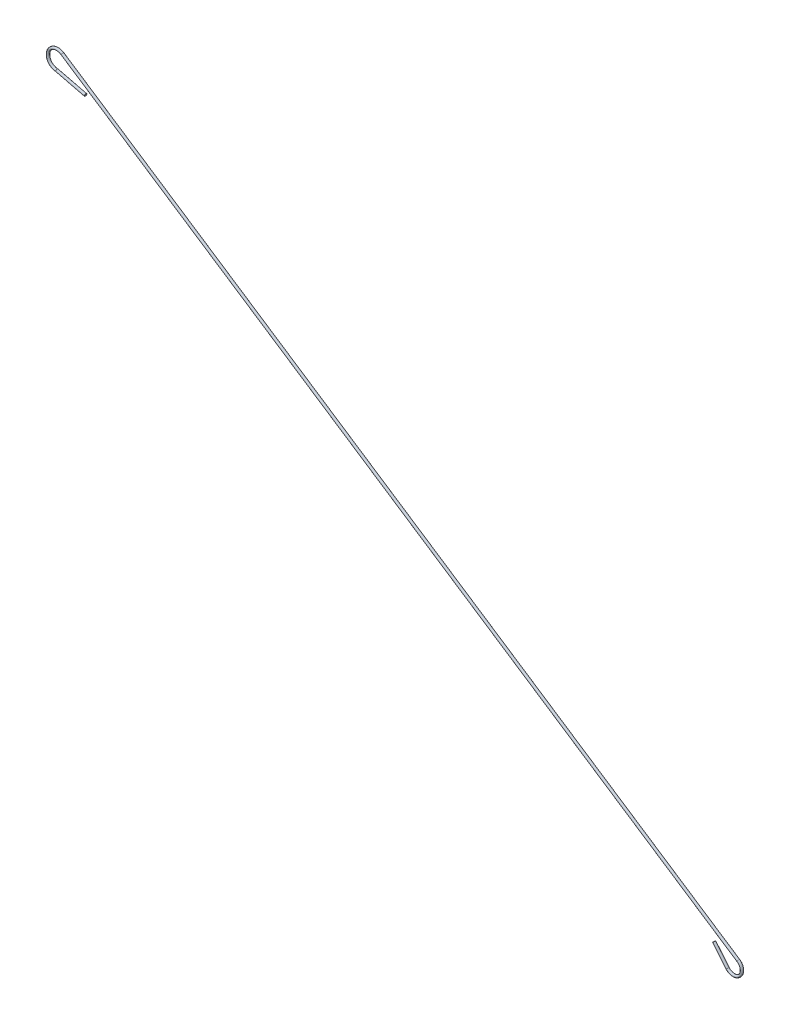
ISO-10303-21;
HEADER;
FILE_DESCRIPTION(('STEP AP214'),'2;1');
FILE_NAME('part.step','',(''),(''),'','','');
FILE_SCHEMA(('AUTOMOTIVE_DESIGN { 1 0 10303 214 1 1 1 1 }'));
ENDSEC;
DATA;
#1=APPLICATION_CONTEXT('core data for automotive mechanical design processes');
#2=APPLICATION_PROTOCOL_DEFINITION('international standard','automotive_design',2000,#1);
#3=PRODUCT_CONTEXT('',#1,'mechanical');
#4=PRODUCT('Part','Part','',(#3));
#5=PRODUCT_RELATED_PRODUCT_CATEGORY('part','',(#4));
#6=PRODUCT_DEFINITION_FORMATION('','',#4);
#7=PRODUCT_DEFINITION_CONTEXT('part definition',#1,'design');
#8=PRODUCT_DEFINITION('design','',#6,#7);
#9=PRODUCT_DEFINITION_SHAPE('','',#8);
#10=(LENGTH_UNIT() NAMED_UNIT(*) SI_UNIT(.MILLI.,.METRE.));
#11=(NAMED_UNIT(*) PLANE_ANGLE_UNIT() SI_UNIT($,.RADIAN.));
#12=(NAMED_UNIT(*) SI_UNIT($,.STERADIAN.) SOLID_ANGLE_UNIT());
#13=UNCERTAINTY_MEASURE_WITH_UNIT(LENGTH_MEASURE(1.E-05),#10,'distance_accuracy_value','');
#14=(GEOMETRIC_REPRESENTATION_CONTEXT(3) GLOBAL_UNCERTAINTY_ASSIGNED_CONTEXT((#13)) GLOBAL_UNIT_ASSIGNED_CONTEXT((#10,
#11,#12)) REPRESENTATION_CONTEXT('',''));
#15=CARTESIAN_POINT('',(0.,0.,0.));
#16=DIRECTION('',(0.,0.,1.));
#17=DIRECTION('',(1.,0.,0.));
#18=AXIS2_PLACEMENT_3D('',#15,#16,#17);
#19=CARTESIAN_POINT('',(-427.811917317596,812.633257480456,-763.238321143035));
#20=DIRECTION('',(-0.97147118341322,0.237157626480192,2.80395346130499E-13));
#21=DIRECTION('',(-0.237157626480192,-0.97147118341322,0.));
#22=AXIS2_PLACEMENT_3D('',#19,#20,#21);
#23=PLANE('',#22);
#24=CARTESIAN_POINT('',(-427.811917317596,812.633257480456,-763.238321143035));
#25=DIRECTION('',(-0.97147118341322,0.237157626480192,2.80395346130499E-13));
#26=DIRECTION('',(-0.237157626480192,-0.97147118341322,0.));
#27=AXIS2_PLACEMENT_3D('',#24,#25,#26);
#28=CIRCLE('',#27,1.190625);
#29=CARTESIAN_POINT('',(-428.094283116624,811.476599602705,-763.238321143035));
#30=VERTEX_POINT('',#29);
#31=EDGE_CURVE('E54',#30,#30,#28,.T.);
#32=ORIENTED_EDGE('',*,*,#31,.F.);
#33=EDGE_LOOP('',(#32));
#34=FACE_BOUND('',#33,.T.);
#35=ADVANCED_FACE('F51',(#34),#23,.F.);
#36=CARTESIAN_POINT('',(179.33350659523,408.024809585461,-763.238321143484));
#37=DIRECTION('',(-0.633306831925421,0.773900805424434,3.07352405207051E-13));
#38=DIRECTION('',(-0.773900805424434,-0.633306831925421,6.42431297641695E-12));
#39=AXIS2_PLACEMENT_3D('',#36,#37,#38);
#40=PLANE('',#39);
#41=CARTESIAN_POINT('',(179.33350659523,408.024809585461,-763.238321143484));
#42=DIRECTION('',(-0.633306831925421,0.773900805424434,3.07352405207051E-13));
#43=DIRECTION('',(-0.773900805424434,-0.633306831925421,6.42431297641695E-12));
#44=AXIS2_PLACEMENT_3D('',#41,#42,#43);
#45=CIRCLE('',#44,1.190625);
#46=CARTESIAN_POINT('',(178.412080948772,407.270778638699,-763.238321143476));
#47=VERTEX_POINT('',#46);
#48=EDGE_CURVE('E79',#47,#47,#45,.T.);
#49=ORIENTED_EDGE('',*,*,#48,.T.);
#50=EDGE_LOOP('',(#49));
#51=FACE_BOUND('',#50,.T.);
#52=ADVANCED_FACE('F74',(#51),#40,.T.);
#53=CARTESIAN_POINT('',(-455.729617251785,819.448586196555,-763.238321143027));
#54=DIRECTION('',(0.971471183413222,-0.237157626480181,-2.84289725937867E-13));
#55=DIRECTION('',(0.237157626480181,0.971471183413223,0.));
#56=AXIS2_PLACEMENT_3D('',#53,#54,#55);
#57=CYLINDRICAL_SURFACE('',#56,1.190625);
#58=CARTESIAN_POINT('',(-455.506947821375,819.394227658349,-762.047696143027));
#59=CARTESIAN_POINT('',(-455.506215987604,819.399379265152,-762.047695914951));
#60=CARTESIAN_POINT('',(-455.505484007496,819.404531909561,-762.047729726224));
#61=CARTESIAN_POINT('',(-455.495280057859,819.476360910007,-762.048674755256));
#62=CARTESIAN_POINT('',(-455.48579689012,819.543117323886,-762.055241874011));
#63=CARTESIAN_POINT('',(-455.471797114903,819.641669784175,-762.073475469619));
#64=CARTESIAN_POINT('',(-455.467160792931,819.674307782612,-762.080969199596));
#65=CARTESIAN_POINT('',(-455.457988837744,819.738875425088,-762.098712502301));
#66=CARTESIAN_POINT('',(-455.453453285487,819.770804499573,-762.108964209834));
#67=CARTESIAN_POINT('',(-455.440070956556,819.865013105617,-762.143713796841));
#68=CARTESIAN_POINT('',(-455.431424486765,819.925883117883,-762.172237607888));
#69=CARTESIAN_POINT('',(-455.414930616801,820.041998825476,-762.239238418446));
#70=CARTESIAN_POINT('',(-455.407083234408,820.09724439565,-762.277715639366));
#71=CARTESIAN_POINT('',(-455.396092977923,820.174616252885,-762.341987826876));
#72=CARTESIAN_POINT('',(-455.392561197763,820.19948021125,-762.364492289753));
#73=CARTESIAN_POINT('',(-455.385780905778,820.247214017897,-762.411518584101));
#74=CARTESIAN_POINT('',(-455.382532124255,820.270085764745,-762.436038450604));
#75=CARTESIAN_POINT('',(-455.373239438633,820.33550732404,-762.512428009248));
#76=CARTESIAN_POINT('',(-455.367646907311,820.374879550011,-762.567141051422));
#77=CARTESIAN_POINT('',(-455.357869488075,820.443714125231,-762.682206143659));
#78=CARTESIAN_POINT('',(-455.353678142155,820.473221939144,-762.742530637829));
#79=CARTESIAN_POINT('',(-455.346785412331,820.521748018074,-762.867348047546));
#80=CARTESIAN_POINT('',(-455.344083960496,820.540766761343,-762.93184077289));
#81=CARTESIAN_POINT('',(-455.340259679259,820.567690449273,-763.062863732348));
#82=CARTESIAN_POINT('',(-455.339130223435,820.575642045191,-763.129384198509));
#83=CARTESIAN_POINT('',(-455.338461217713,820.580351979332,-763.262827796362));
#84=CARTESIAN_POINT('',(-455.338921645285,820.577110476173,-763.329750922335));
#85=CARTESIAN_POINT('',(-455.341416733697,820.559544558942,-763.461961774375));
#86=CARTESIAN_POINT('',(-455.343448256772,820.545242235345,-763.527252492661));
#87=CARTESIAN_POINT('',(-455.349021425584,820.506006070578,-763.654480094402));
#88=CARTESIAN_POINT('',(-455.352563090555,820.481072093993,-763.716416935129));
#89=CARTESIAN_POINT('',(-455.361062924391,820.421231813305,-763.835293274604));
#90=CARTESIAN_POINT('',(-455.366022734106,820.386313957461,-763.892226884076));
#91=CARTESIAN_POINT('',(-455.374405842347,820.327295737599,-763.972539883299));
#92=CARTESIAN_POINT('',(-455.377358022983,820.306512015804,-763.998466933777));
#93=CARTESIAN_POINT('',(-455.383560070111,820.262848920525,-764.048498526526));
#94=CARTESIAN_POINT('',(-455.386810218447,820.239967562916,-764.072601303076));
#95=CARTESIAN_POINT('',(-455.397024400982,820.168058924099,-764.142240904372));
#96=CARTESIAN_POINT('',(-455.404410711185,820.116058972842,-764.18471216823));
#97=CARTESIAN_POINT('',(-455.420082046356,820.005732993514,-764.260221603041));
#98=CARTESIAN_POINT('',(-455.428367083088,819.947406882644,-764.293259650507));
#99=CARTESIAN_POINT('',(-455.441288493394,819.856442055213,-764.335072813824));
#100=CARTESIAN_POINT('',(-455.445683169117,819.825504353283,-764.347729759628));
#101=CARTESIAN_POINT('',(-455.454602117069,819.762717020815,-764.37036455994));
#102=CARTESIAN_POINT('',(-455.459126274343,819.730868199189,-764.380344713985));
#103=CARTESIAN_POINT('',(-455.472837531514,819.634345435138,-764.406137302704));
#104=CARTESIAN_POINT('',(-455.482186211842,819.56853471872,-764.417875426687));
#105=CARTESIAN_POINT('',(-455.495970900789,819.471498098878,-764.426819165083));
#106=CARTESIAN_POINT('',(-455.500360413148,819.440598598772,-764.428439519857));
#107=CARTESIAN_POINT('',(-455.50548387418,819.404532849087,-764.428912301333));
#108=CARTESIAN_POINT('',(-455.506215844573,819.399380272763,-764.428946088555));
#109=CARTESIAN_POINT('',(-455.506947821457,819.394227658017,-764.428946143027));
#110=B_SPLINE_CURVE_WITH_KNOTS('',3,(#58,#59,#60,#61,#62,#63,#64,#65,#66,#67,#68,#69,#70,#71,
#72,#73,#74,#75,#76,#77,#78,#79,#80,#81,#82,#83,#84,#85,#86,#87,#88,#89,#90,#91,#92,#93,#94,#95,
#96,#97,#98,#99,#100,#101,#102,#103,#104,#105,#106,#107,#108,#109),.UNSPECIFIED.,.F.,.F.,(4,2,2,
2,2,2,2,2,2,2,2,2,2,2,2,2,2,2,2,2,2,2,2,2,2,4),(0.,0.0156128978433105,0.217626923769604,
0.318958240078146,0.420368218419293,0.622673919988737,0.824984122134778,0.926042621814403,
1.02700373483835,1.22886358601933,1.42977981651817,1.63068688540176,1.83074448072526,
2.03079924101315,2.23045548402431,2.43011427011465,2.63000501063117,2.72998419446327,
2.83005894271063,3.03167255656076,3.23328880954208,3.33432481610452,3.43527374615147,
3.63664403113962,3.73032278199967,3.74593567987358),.UNSPECIFIED.);
#111=CARTESIAN_POINT('',(-455.506947821375,819.394227658349,-762.047696143027));
#112=VERTEX_POINT('',#111);
#113=CARTESIAN_POINT('',(-455.506947821457,819.394227658017,-764.428946143027));
#114=VERTEX_POINT('',#113);
#115=EDGE_CURVE('E12',#112,#114,#110,.T.);
#116=ORIENTED_EDGE('',*,*,#115,.F.);
#117=CARTESIAN_POINT('',(-455.506947821375,819.394227658349,-762.047696143027));
#118=CARTESIAN_POINT('',(-455.507679651034,819.389076051459,-762.047695914888));
#119=CARTESIAN_POINT('',(-455.508411851647,819.383923438271,-762.047729726174));
#120=CARTESIAN_POINT('',(-455.518617781846,819.312124939185,-762.048674377956));
#121=CARTESIAN_POINT('',(-455.528139896207,819.245404302967,-762.055236211645));
#122=CARTESIAN_POINT('',(-455.542251726922,819.146911880592,-762.073457351917));
#123=CARTESIAN_POINT('',(-455.546934448893,819.114295053425,-762.080946142652));
#124=CARTESIAN_POINT('',(-455.556215723445,819.049771690596,-762.09867842135));
#125=CARTESIAN_POINT('',(-455.560814207841,819.017865726181,-762.108924043962));
#126=CARTESIAN_POINT('',(-455.574407395764,818.923727935185,-762.143654534116));
#127=CARTESIAN_POINT('',(-455.583223917142,818.862908222617,-762.172164279168));
#128=CARTESIAN_POINT('',(-455.60009670213,818.746897534152,-762.239134975519));
#129=CARTESIAN_POINT('',(-455.608152948966,818.691706682433,-762.277596146288));
#130=CARTESIAN_POINT('',(-455.619465809826,818.614422217088,-762.341837742253));
#131=CARTESIAN_POINT('',(-455.623106288238,818.589590521813,-762.364328291743));
#132=CARTESIAN_POINT('',(-455.630104273477,818.54191966187,-762.411325087488));
#133=CARTESIAN_POINT('',(-455.633462049657,818.519078599817,-762.435829370069));
#134=CARTESIAN_POINT('',(-455.643077676558,818.453745405097,-762.512169557639));
#135=CARTESIAN_POINT('',(-455.648880167812,818.414427284398,-762.566846107033));
#136=CARTESIAN_POINT('',(-455.659043514369,818.345672757979,-762.681848619325));
#137=CARTESIAN_POINT('',(-455.663410575927,818.316193802646,-762.742148774722));
#138=CARTESIAN_POINT('',(-455.67060099163,818.267706462117,-762.866915207789));
#139=CARTESIAN_POINT('',(-455.673424410663,818.248697636797,-762.931381310212));
#140=CARTESIAN_POINT('',(-455.677426956591,818.22176181659,-763.062390509499));
#141=CARTESIAN_POINT('',(-455.678612026129,818.213794770555,-763.128925200062));
#142=CARTESIAN_POINT('',(-455.679318909851,818.209041679464,-763.262401227338));
#143=CARTESIAN_POINT('',(-455.678840744028,818.212255500012,-763.329342559154));
#144=CARTESIAN_POINT('',(-455.676238558345,818.229758556292,-763.46161733251));
#145=CARTESIAN_POINT('',(-455.674117255339,818.244029509554,-763.526953244732));
#146=CARTESIAN_POINT('',(-455.668301978558,818.283204011499,-763.654273059037));
#147=CARTESIAN_POINT('',(-455.664607980623,818.308107723519,-763.716256909611));
#148=CARTESIAN_POINT('',(-455.655757670498,818.36788782864,-763.835213604914));
#149=CARTESIAN_POINT('',(-455.650599950513,818.40277382288,-763.892181555943));
#150=CARTESIAN_POINT('',(-455.641902066748,818.461749640698,-763.972542217068));
#151=CARTESIAN_POINT('',(-455.638841983763,818.482519937224,-763.998484332991));
#152=CARTESIAN_POINT('',(-455.63242103764,818.526158387955,-764.048544220208));
#153=CARTESIAN_POINT('',(-455.629059892569,818.54902850908,-764.072660241606));
#154=CARTESIAN_POINT('',(-455.618549357286,818.620646787442,-764.142083903105));
#155=CARTESIAN_POINT('',(-455.610983810013,818.672328778637,-764.184366383355));
#156=CARTESIAN_POINT('',(-455.594988492246,818.781971311061,-764.259593392493));
#157=CARTESIAN_POINT('',(-455.586558708039,818.839931951908,-764.292537773191));
#158=CARTESIAN_POINT('',(-455.573423418448,818.930585905223,-764.334405619344));
#159=CARTESIAN_POINT('',(-455.568938533018,818.961594259012,-764.347149787044));
#160=CARTESIAN_POINT('',(-455.559852502883,819.024535249325,-764.369941409951));
#161=CARTESIAN_POINT('',(-455.55525146054,819.056467075433,-764.379991154653));
#162=CARTESIAN_POINT('',(-455.541333151372,819.15325428721,-764.405964676948));
#163=CARTESIAN_POINT('',(-455.531877389456,819.219262196186,-764.417786796208));
#164=CARTESIAN_POINT('',(-455.517982012339,819.316654402481,-764.426803127542));
#165=CARTESIAN_POINT('',(-455.513560202012,819.347704733832,-764.428437517434));
#166=CARTESIAN_POINT('',(-455.508411989057,819.383922499231,-764.428912300994));
#167=CARTESIAN_POINT('',(-455.50767979857,819.389075044435,-764.428946088199));
#168=CARTESIAN_POINT('',(-455.506947821457,819.394227658017,-764.428946143027));
#169=B_SPLINE_CURVE_WITH_KNOTS('',3,(#117,#118,#119,#120,#121,#122,#123,#124,#125,#126,#127,
#128,#129,#130,#131,#132,#133,#134,#135,#136,#137,#138,#139,#140,#141,#142,#143,#144,#145,#146,
#147,#148,#149,#150,#151,#152,#153,#154,#155,#156,#157,#158,#159,#160,#161,#162,#163,#164,#165,
#166,#167,#168),.UNSPECIFIED.,.F.,.F.,(4,2,2,2,2,2,2,2,2,2,2,2,2,2,2,2,2,2,2,2,2,2,2,2,2,4),(0.,
0.0156128978628568,0.217537158681582,0.31882307801608,0.420187651028619,0.622405831190798,
0.824628471476367,0.925622579108062,1.02651934599287,1.22825090969588,1.42909842391222,
1.62993749463465,1.83004615083755,2.03015240171508,2.22992849019712,2.42970764769069,
2.62967960601839,2.72969785225555,2.82981076114542,3.0304083849154,3.23100919189691,
3.33237209743685,3.43364859834372,3.63567243167567,3.72981315416662,3.74542605205941),.UNSPECIFIED.);
#170=EDGE_CURVE('E59',#112,#114,#169,.T.);
#171=ORIENTED_EDGE('',*,*,#170,.T.);
#172=EDGE_LOOP('',(#116,#171));
#173=FACE_BOUND('',#172,.T.);
#174=ORIENTED_EDGE('',*,*,#31,.T.);
#175=EDGE_LOOP('',(#174));
#176=FACE_BOUND('',#175,.T.);
#177=ADVANCED_FACE('F70',(#173,#176),#57,.T.);
#178=CARTESIAN_POINT('',(179.33350659523,408.024809585461,-763.238321143484));
#179=DIRECTION('',(0.63330683192543,-0.773900805424426,-3.11246785014493E-13));
#180=DIRECTION('',(0.773900805424426,0.63330683192543,0.));
#181=AXIS2_PLACEMENT_3D('',#178,#179,#180);
#182=CYLINDRICAL_SURFACE('',#181,1.190625);
#183=CARTESIAN_POINT('',(192.209904372681,392.289854412724,-763.23832114349));
#184=DIRECTION('',(-0.633306831925421,0.773900805424434,3.07352405207051E-13));
#185=DIRECTION('',(-0.773900805424434,-0.633306831925421,6.42431297641695E-12));
#186=AXIS2_PLACEMENT_3D('',#183,#184,#185);
#187=CIRCLE('',#186,1.190625);
#188=CARTESIAN_POINT('',(191.288478726222,391.535823465963,-763.238321143488));
#189=VERTEX_POINT('',#188);
#190=EDGE_CURVE('E81',#189,#189,#187,.T.);
#191=ORIENTED_EDGE('',*,*,#190,.T.);
#192=EDGE_LOOP('',(#191));
#193=FACE_BOUND('',#192,.T.);
#194=ORIENTED_EDGE('',*,*,#48,.F.);
#195=EDGE_LOOP('',(#194));
#196=FACE_BOUND('',#195,.T.);
#197=ADVANCED_FACE('F73',(#193,#196),#182,.T.);
#198=CARTESIAN_POINT('',(198.312321245531,397.283649831651,-763.2383211435));
#199=DIRECTION('',(1.15101615086029E-12,5.42068768295062E-13,1.));
#200=DIRECTION('',(1.,0.,-1.15101615086029E-12));
#201=AXIS2_PLACEMENT_3D('',#198,#199,#200);
#202=TOROIDAL_SURFACE('',#201,7.88527008897896,1.190625);
#203=CARTESIAN_POINT('',(202.664175314005,403.859275318466,-763.238321143508));
#204=DIRECTION('',(0.83391252456977,-0.551896640110875,-6.6457523206083E-13));
#205=DIRECTION('',(0.551896640110875,0.83391252456977,4.10296491444247E-12));
#206=AXIS2_PLACEMENT_3D('',#203,#204,#205);
#207=CIRCLE('',#206,1.190625);
#208=CARTESIAN_POINT('',(203.321277251137,404.852152418032,-763.23832114351));
#209=VERTEX_POINT('',#208);
#210=EDGE_CURVE('E86',#209,#209,#207,.T.);
#211=CARTESIAN_POINT('',(198.312321245531,397.283649831651,-763.2383211435));
#212=DIRECTION('',(1.15101615086029E-12,5.42068768295062E-13,1.));
#213=DIRECTION('',(1.,0.,-1.15101615086029E-12));
#214=AXIS2_PLACEMENT_3D('',#211,#212,#213);
#215=CIRCLE('',#214,9.07589508897896);
#216=EDGE_CURVE('',#189,#209,#215,.T.);
#217=ORIENTED_EDGE('',*,*,#190,.F.);
#218=ORIENTED_EDGE('',*,*,#210,.T.);
#219=ORIENTED_EDGE('',*,*,#216,.T.);
#220=ORIENTED_EDGE('',*,*,#216,.F.);
#221=EDGE_LOOP('',(#217,#219,#218,#220));
#222=FACE_BOUND('',#221,.T.);
#223=ADVANCED_FACE('F117',(#222),#202,.T.);
#224=CARTESIAN_POINT('',(202.664175314005,403.859275318466,-763.238321143508));
#225=DIRECTION('',(-0.83391252456978,0.551896640110861,6.61594570082882E-13));
#226=DIRECTION('',(-0.551896640110861,-0.83391252456978,0.));
#227=AXIS2_PLACEMENT_3D('',#224,#225,#226);
#228=CYLINDRICAL_SURFACE('',#227,1.190625);
#229=CARTESIAN_POINT('',(-450.151301902883,835.902994381497,-763.23832114299));
#230=DIRECTION('',(0.833912524569774,-0.55189664011087,-6.65488949890298E-13));
#231=DIRECTION('',(0.55189664011087,0.833912524569774,4.10296491444248E-12));
#232=AXIS2_PLACEMENT_3D('',#229,#230,#231);
#233=CIRCLE('',#232,1.190625);
#234=CARTESIAN_POINT('',(-449.494199965751,836.895871481063,-763.238321142985));
#235=VERTEX_POINT('',#234);
#236=EDGE_CURVE('E69',#235,#235,#233,.T.);
#237=ORIENTED_EDGE('',*,*,#236,.T.);
#238=EDGE_LOOP('',(#237));
#239=FACE_BOUND('',#238,.T.);
#240=ORIENTED_EDGE('',*,*,#210,.F.);
#241=EDGE_LOOP('',(#240));
#242=FACE_BOUND('',#241,.T.);
#243=ADVANCED_FACE('F113',(#239,#242),#228,.T.);
#244=CARTESIAN_POINT('',(-449.494199965751,836.895871481063,-763.238321142985));
#245=CARTESIAN_POINT('',(-450.799290368604,837.759601173511,-763.238321142984));
#246=CARTESIAN_POINT('',(-452.305697131396,838.317040742987,-763.238321142985));
#247=CARTESIAN_POINT('',(-455.411626219133,838.70480449474,-763.238321142985));
#248=CARTESIAN_POINT('',(-457.008846794635,838.534841185737,-763.238321142988));
#249=CARTESIAN_POINT('',(-459.963622143405,837.502146234793,-763.238321142988));
#250=CARTESIAN_POINT('',(-461.318987409402,836.640179826368,-763.238321142919));
#251=CARTESIAN_POINT('',(-463.507188807719,834.402115737737,-763.238321143072));
#252=CARTESIAN_POINT('',(-464.338403468991,833.027676477408,-763.238321142928));
#253=CARTESIAN_POINT('',(-465.304272624066,830.050386938444,-763.238321143082));
#254=CARTESIAN_POINT('',(-465.438211402914,828.449742850299,-763.238321142938));
#255=CARTESIAN_POINT('',(-464.980577217235,825.353337325061,-763.238321143091));
#256=CARTESIAN_POINT('',(-464.389343362918,823.859870344366,-763.238321142946));
#257=CARTESIAN_POINT('',(-462.60352182283,821.289267758867,-763.238321143099));
#258=CARTESIAN_POINT('',(-461.410257392489,820.214036959606,-763.238321143027));
#259=CARTESIAN_POINT('',(-459.353713799898,819.081990837053,-763.238321143027));
#260=CARTESIAN_POINT('',(-458.624791681132,818.783982657191,-763.238321142989));
#261=CARTESIAN_POINT('',(-457.494487691739,818.467509203745,-763.238321143047));
#262=CARTESIAN_POINT('',(-457.111631775542,818.383724252213,-763.238321143028));
#263=CARTESIAN_POINT('',(-456.532023875857,818.291443265598,-763.238321143028));
#264=CARTESIAN_POINT('',(-456.33793413396,818.266244067869,-763.238321143027));
#265=CARTESIAN_POINT('',(-455.948603379252,818.227051115322,-763.238321143027));
#266=CARTESIAN_POINT('',(-455.741948081288,818.212574165612,-763.238321143018));
#267=CARTESIAN_POINT('',(-455.476469197775,818.201206601331,-763.238321143031));
#268=CARTESIAN_POINT('',(-455.405181608354,818.198158640292,-763.238321143027));
#269=CARTESIAN_POINT('',(-455.328848631516,818.194892386007,-763.238321143027));
#270=CARTESIAN_POINT('',(-449.494199965755,836.895871481054,-760.857071142985));
#271=CARTESIAN_POINT('',(-450.799290368608,837.759601173502,-760.857071142984));
#272=CARTESIAN_POINT('',(-452.305697131398,838.317040742939,-760.857071142985));
#273=CARTESIAN_POINT('',(-455.411626219135,838.704804494768,-760.857071142985));
#274=CARTESIAN_POINT('',(-457.008846794634,838.534841185728,-760.857071142988));
#275=CARTESIAN_POINT('',(-459.963622143405,837.502146234783,-760.857071142988));
#276=CARTESIAN_POINT('',(-461.318987409438,836.64017982636,-760.857071142919));
#277=CARTESIAN_POINT('',(-463.507188807679,834.402115737728,-760.857071143072));
#278=CARTESIAN_POINT('',(-464.338403468988,833.02767647744,-760.857071142928));
#279=CARTESIAN_POINT('',(-465.304272624062,830.050386938399,-760.857071143082));
#280=CARTESIAN_POINT('',(-465.438211402911,828.449742850295,-760.857071142938));
#281=CARTESIAN_POINT('',(-464.980577217231,825.353337325057,-760.857071143091));
#282=CARTESIAN_POINT('',(-464.389343362896,823.859870344325,-760.857071142946));
#283=CARTESIAN_POINT('',(-462.603521822846,821.289267758904,-760.857071143099));
#284=CARTESIAN_POINT('',(-461.410257392469,820.214036959606,-760.857071143027));
#285=CARTESIAN_POINT('',(-459.353713799907,819.081990837052,-760.857071143027));
#286=CARTESIAN_POINT('',(-458.624791681132,818.78398265721,-760.857071142989));
#287=CARTESIAN_POINT('',(-457.494487691739,818.467509203735,-760.857071143047));
#288=CARTESIAN_POINT('',(-457.111631775547,818.383724252213,-760.857071143027));
#289=CARTESIAN_POINT('',(-456.532023875855,818.291443265598,-760.857071143027));
#290=CARTESIAN_POINT('',(-456.337934133956,818.266244067874,-760.857071143027));
#291=CARTESIAN_POINT('',(-455.948603379258,818.227051115318,-760.857071143027));
#292=CARTESIAN_POINT('',(-455.741948081294,818.212574165617,-760.857071143017));
#293=CARTESIAN_POINT('',(-455.476469197774,818.201206601329,-760.857071143031));
#294=CARTESIAN_POINT('',(-455.405181608355,818.198158640292,-760.857071143027));
#295=CARTESIAN_POINT('',(-455.328848631517,818.194892386008,-760.857071143027));
#296=CARTESIAN_POINT('',(-450.808403840019,834.910117281922,-760.857071142995));
#297=CARTESIAN_POINT('',(-451.808725147993,835.572145915186,-760.857071142994));
#298=CARTESIAN_POINT('',(-452.963350743284,835.999410323857,-760.857071142995));
#299=CARTESIAN_POINT('',(-455.343972837137,836.296622181766,-760.857071142995));
#300=CARTESIAN_POINT('',(-456.5682050985,836.166349275616,-760.857071142997));
#301=CARTESIAN_POINT('',(-458.832971382339,835.374812718575,-760.857071142997));
#302=CARTESIAN_POINT('',(-459.871827198465,834.714135601427,-760.857071142926));
#303=CARTESIAN_POINT('',(-461.549032455801,832.99871175661,-760.857071143079));
#304=CARTESIAN_POINT('',(-462.18613907712,831.945236169315,-760.857071142933));
#305=CARTESIAN_POINT('',(-462.926455222669,829.663213284844,-760.857071143087));
#306=CARTESIAN_POINT('',(-463.029116167924,828.436356980902,-760.857071143017));
#307=CARTESIAN_POINT('',(-462.678350254547,826.063034475219,-760.857071143017));
#308=CARTESIAN_POINT('',(-462.225183315933,824.918326920622,-760.857071143024));
#309=CARTESIAN_POINT('',(-460.856392820756,822.948020086013,-760.857071143024));
#310=CARTESIAN_POINT('',(-459.941783508537,822.123880794838,-760.857071143104));
#311=CARTESIAN_POINT('',(-458.365490883956,821.256193885539,-760.857071142989));
#312=CARTESIAN_POINT('',(-457.80678910695,821.027777576927,-760.857071142989));
#313=CARTESIAN_POINT('',(-456.940437501991,820.785208067369,-760.857071143047));
#314=CARTESIAN_POINT('',(-456.646987385447,820.720988859181,-760.857071143027));
#315=CARTESIAN_POINT('',(-456.202731469466,820.650257638546,-760.857071143027));
#316=CARTESIAN_POINT('',(-456.053966216082,820.63094304213,-760.857071143027));
#317=CARTESIAN_POINT('',(-455.75555328704,820.600902559496,-760.857071143027));
#318=CARTESIAN_POINT('',(-455.617319988181,820.590669088395,-760.857071143027));
#319=CARTESIAN_POINT('',(-455.384760699006,820.580711969905,-760.857071143027));
#320=CARTESIAN_POINT('',(-455.303382127197,820.577231658956,-760.857071143027));
#321=CARTESIAN_POINT('',(-455.227049150358,820.573965404672,-760.857071143027));
#322=CARTESIAN_POINT('',(-450.808403840015,834.910117281931,-763.238321142995));
#323=CARTESIAN_POINT('',(-451.808725147989,835.572145915195,-763.238321142994));
#324=CARTESIAN_POINT('',(-452.963350743282,835.999410323905,-763.238321142995));
#325=CARTESIAN_POINT('',(-455.343972837135,836.296622181738,-763.238321142995));
#326=CARTESIAN_POINT('',(-456.568205098463,836.166349275626,-763.238321142997));
#327=CARTESIAN_POINT('',(-458.832971382378,835.374812718584,-763.238321142997));
#328=CARTESIAN_POINT('',(-459.871827198467,834.714135601436,-763.238321142926));
#329=CARTESIAN_POINT('',(-461.549032455804,832.998711756619,-763.238321143079));
#330=CARTESIAN_POINT('',(-462.186139077123,831.945236169283,-763.238321142933));
#331=CARTESIAN_POINT('',(-462.926455222673,829.663213284889,-763.238321143087));
#332=CARTESIAN_POINT('',(-463.029116167927,828.436356980945,-763.238321143018));
#333=CARTESIAN_POINT('',(-462.67835025455,826.063034475184,-763.238321143018));
#334=CARTESIAN_POINT('',(-462.225183315954,824.918326920663,-763.238321143024));
#335=CARTESIAN_POINT('',(-460.85639282074,822.948020085977,-763.238321143024));
#336=CARTESIAN_POINT('',(-459.941783508519,822.123880794838,-763.238321143104));
#337=CARTESIAN_POINT('',(-458.365490883966,821.25619388554,-763.238321142989));
#338=CARTESIAN_POINT('',(-457.80678910695,821.027777576907,-763.238321142989));
#339=CARTESIAN_POINT('',(-456.940437501991,820.785208067379,-763.238321143047));
#340=CARTESIAN_POINT('',(-456.646987385447,820.720988859181,-763.238321143027));
#341=CARTESIAN_POINT('',(-456.202731469466,820.650257638546,-763.238321143027));
#342=CARTESIAN_POINT('',(-456.053966216086,820.630943042125,-763.238321143027));
#343=CARTESIAN_POINT('',(-455.755553287034,820.600902559501,-763.238321143027));
#344=CARTESIAN_POINT('',(-455.617319988175,820.59066908839,-763.238321143027));
#345=CARTESIAN_POINT('',(-455.384760699007,820.580711969907,-763.238321143027));
#346=CARTESIAN_POINT('',(-455.303382127195,820.577231658956,-763.238321143027));
#347=CARTESIAN_POINT('',(-455.227049150357,820.573965404672,-763.238321143027));
#348=CARTESIAN_POINT('',(-450.80840384001,834.91011728194,-765.619571142995));
#349=CARTESIAN_POINT('',(-451.808725147986,835.572145915205,-765.619571142995));
#350=CARTESIAN_POINT('',(-452.96335074328,835.999410323953,-765.619571142995));
#351=CARTESIAN_POINT('',(-455.343972837133,836.296622181709,-765.619571142995));
#352=CARTESIAN_POINT('',(-456.568205098424,836.166349275636,-765.619571142997));
#353=CARTESIAN_POINT('',(-458.832971382416,835.374812718594,-765.619571142997));
#354=CARTESIAN_POINT('',(-459.871827198469,834.714135601444,-765.619571142926));
#355=CARTESIAN_POINT('',(-461.549032455806,832.998711756627,-765.619571143079));
#356=CARTESIAN_POINT('',(-462.186139077127,831.945236169251,-765.619571142933));
#357=CARTESIAN_POINT('',(-462.926455222676,829.663213284934,-765.619571143087));
#358=CARTESIAN_POINT('',(-463.029116167931,828.436356980988,-765.619571143018));
#359=CARTESIAN_POINT('',(-462.678350254554,826.06303447515,-765.619571143018));
#360=CARTESIAN_POINT('',(-462.225183315976,824.918326920703,-765.619571143024));
#361=CARTESIAN_POINT('',(-460.856392820723,822.94802008594,-765.619571143024));
#362=CARTESIAN_POINT('',(-459.941783508501,822.123880794839,-765.619571143104));
#363=CARTESIAN_POINT('',(-458.365490883977,821.25619388554,-765.619571142989));
#364=CARTESIAN_POINT('',(-457.80678910695,821.027777576888,-765.619571142989));
#365=CARTESIAN_POINT('',(-456.940437501991,820.785208067389,-765.619571143047));
#366=CARTESIAN_POINT('',(-456.646987385446,820.720988859181,-765.619571143028));
#367=CARTESIAN_POINT('',(-456.202731469465,820.650257638546,-765.619571143028));
#368=CARTESIAN_POINT('',(-456.05396621609,820.63094304212,-765.619571143027));
#369=CARTESIAN_POINT('',(-455.755553287029,820.600902559505,-765.619571143027));
#370=CARTESIAN_POINT('',(-455.617319988169,820.590669088385,-765.619571143027));
#371=CARTESIAN_POINT('',(-455.384760699008,820.580711969909,-765.619571143027));
#372=CARTESIAN_POINT('',(-455.303382127194,820.577231658956,-765.619571143027));
#373=CARTESIAN_POINT('',(-455.227049150356,820.573965404672,-765.619571143027));
#374=CARTESIAN_POINT('',(-449.494199965746,836.895871481072,-765.619571142986));
#375=CARTESIAN_POINT('',(-450.799290368601,837.759601173521,-765.619571142985));
#376=CARTESIAN_POINT('',(-452.305697131394,838.317040743036,-765.619571142985));
#377=CARTESIAN_POINT('',(-455.411626219131,838.704804494711,-765.619571142985));
#378=CARTESIAN_POINT('',(-457.008846794635,838.534841185747,-765.619571142988));
#379=CARTESIAN_POINT('',(-459.963622143406,837.502146234803,-765.619571142988));
#380=CARTESIAN_POINT('',(-461.318987409366,836.640179826377,-765.619571142919));
#381=CARTESIAN_POINT('',(-463.50718880776,834.402115737745,-765.619571143072));
#382=CARTESIAN_POINT('',(-464.338403468995,833.027676477376,-765.619571142928));
#383=CARTESIAN_POINT('',(-465.304272624069,830.050386938489,-765.619571143082));
#384=CARTESIAN_POINT('',(-465.438211402918,828.449742850303,-765.619571142938));
#385=CARTESIAN_POINT('',(-464.980577217238,825.353337325065,-765.619571143092));
#386=CARTESIAN_POINT('',(-464.38934336294,823.859870344406,-765.619571142946));
#387=CARTESIAN_POINT('',(-462.603521822813,821.289267758831,-765.6195711431));
#388=CARTESIAN_POINT('',(-461.410257392509,820.214036959607,-765.619571143027));
#389=CARTESIAN_POINT('',(-459.35371379989,819.081990837053,-765.619571143027));
#390=CARTESIAN_POINT('',(-458.624791681132,818.783982657171,-765.619571142989));
#391=CARTESIAN_POINT('',(-457.494487691739,818.467509203755,-765.619571143047));
#392=CARTESIAN_POINT('',(-457.111631775537,818.383724252213,-765.619571143028));
#393=CARTESIAN_POINT('',(-456.532023875859,818.291443265598,-765.619571143028));
#394=CARTESIAN_POINT('',(-456.337934133964,818.266244067864,-765.619571143027));
#395=CARTESIAN_POINT('',(-455.948603379247,818.227051115327,-765.619571143027));
#396=CARTESIAN_POINT('',(-455.741948081282,818.212574165607,-765.619571143018));
#397=CARTESIAN_POINT('',(-455.476469197776,818.201206601333,-765.619571143031));
#398=CARTESIAN_POINT('',(-455.405181608353,818.198158640292,-765.619571143027));
#399=CARTESIAN_POINT('',(-455.328848631515,818.194892386007,-765.619571143027));
#400=CARTESIAN_POINT('',(-449.494199965751,836.895871481063,-763.238321142985));
#401=CARTESIAN_POINT('',(-450.799290368604,837.759601173511,-763.238321142984));
#402=CARTESIAN_POINT('',(-452.305697131396,838.317040742987,-763.238321142985));
#403=CARTESIAN_POINT('',(-455.411626219133,838.70480449474,-763.238321142985));
#404=CARTESIAN_POINT('',(-457.008846794635,838.534841185737,-763.238321142988));
#405=CARTESIAN_POINT('',(-459.963622143405,837.502146234793,-763.238321142988));
#406=CARTESIAN_POINT('',(-461.318987409402,836.640179826368,-763.238321142919));
#407=CARTESIAN_POINT('',(-463.507188807719,834.402115737737,-763.238321143072));
#408=CARTESIAN_POINT('',(-464.338403468991,833.027676477408,-763.238321142928));
#409=CARTESIAN_POINT('',(-465.304272624066,830.050386938444,-763.238321143082));
#410=CARTESIAN_POINT('',(-465.438211402914,828.449742850299,-763.238321142938));
#411=CARTESIAN_POINT('',(-464.980577217235,825.353337325061,-763.238321143091));
#412=CARTESIAN_POINT('',(-464.389343362918,823.859870344366,-763.238321142946));
#413=CARTESIAN_POINT('',(-462.60352182283,821.289267758867,-763.238321143099));
#414=CARTESIAN_POINT('',(-461.410257392489,820.214036959606,-763.238321143027));
#415=CARTESIAN_POINT('',(-459.353713799898,819.081990837053,-763.238321143027));
#416=CARTESIAN_POINT('',(-458.624791681132,818.783982657191,-763.238321142989));
#417=CARTESIAN_POINT('',(-457.494487691739,818.467509203745,-763.238321143047));
#418=CARTESIAN_POINT('',(-457.111631775542,818.383724252213,-763.238321143028));
#419=CARTESIAN_POINT('',(-456.532023875857,818.291443265598,-763.238321143028));
#420=CARTESIAN_POINT('',(-456.33793413396,818.266244067869,-763.238321143027));
#421=CARTESIAN_POINT('',(-455.948603379252,818.227051115322,-763.238321143027));
#422=CARTESIAN_POINT('',(-455.741948081288,818.212574165612,-763.238321143018));
#423=CARTESIAN_POINT('',(-455.476469197775,818.201206601331,-763.238321143031));
#424=CARTESIAN_POINT('',(-455.405181608354,818.198158640292,-763.238321143027));
#425=CARTESIAN_POINT('',(-455.328848631516,818.194892386007,-763.238321143027));
#426=(BOUNDED_SURFACE() B_SPLINE_SURFACE(3,3,((#244,#245,#246,#247,#248,#249,#250,#251,#252,
#253,#254,#255,#256,#257,#258,#259,#260,#261,#262,#263,#264,#265,#266,#267,#268,#269),(#270,
#271,#272,#273,#274,#275,#276,#277,#278,#279,#280,#281,#282,#283,#284,#285,#286,#287,#288,#289,
#290,#291,#292,#293,#294,#295),(#296,#297,#298,#299,#300,#301,#302,#303,#304,#305,#306,#307,
#308,#309,#310,#311,#312,#313,#314,#315,#316,#317,#318,#319,#320,#321),(#322,#323,#324,#325,
#326,#327,#328,#329,#330,#331,#332,#333,#334,#335,#336,#337,#338,#339,#340,#341,#342,#343,#344,
#345,#346,#347),(#348,#349,#350,#351,#352,#353,#354,#355,#356,#357,#358,#359,#360,#361,#362,
#363,#364,#365,#366,#367,#368,#369,#370,#371,#372,#373),(#374,#375,#376,#377,#378,#379,#380,
#381,#382,#383,#384,#385,#386,#387,#388,#389,#390,#391,#392,#393,#394,#395,#396,#397,#398,#399),
(#400,#401,#402,#403,#404,#405,#406,#407,#408,#409,#410,#411,#412,#413,#414,#415,#416,#417,#418,
#419,#420,#421,#422,#423,#424,#425)),.UNSPECIFIED.,.T.,.F.,.F.) B_SPLINE_SURFACE_WITH_KNOTS((4,
3,4),(4,2,2,2,2,2,2,2,2,2,2,2,4),(0.,0.5,1.),(0.961580121167201,0.966382606021301,
0.971185090875401,0.9759875757295,0.9807900605836,0.9855925454377,0.9903950302918,
0.9951975151459,0.99759875757295,0.998799378786475,0.999399689393238,1.,1.0002653566399),
.UNSPECIFIED.) GEOMETRIC_REPRESENTATION_ITEM() RATIONAL_B_SPLINE_SURFACE(((1.,1.,1.,1.,1.,1.,1.,
1.,1.,1.,1.,1.,1.,1.,1.,1.,1.,1.,1.,1.,1.,1.,1.,1.,1.,1.),(0.333333333333333,0.333333333333333,
0.333333333333333,0.333333333333333,0.333333333333333,0.333333333333333,0.333333333333333,
0.333333333333333,0.333333333333333,0.333333333333333,0.333333333333333,0.333333333333333,
0.333333333333333,0.333333333333333,0.333333333333333,0.333333333333333,0.333333333333333,
0.333333333333333,0.333333333333333,0.333333333333333,0.333333333333333,0.333333333333333,
0.333333333333333,0.333333333333333,0.333333333333333,0.333333333333333),(0.333333333333333,
0.333333333333333,0.333333333333333,0.333333333333333,0.333333333333333,0.333333333333333,
0.333333333333333,0.333333333333333,0.333333333333333,0.333333333333333,0.333333333333333,
0.333333333333333,0.333333333333333,0.333333333333333,0.333333333333333,0.333333333333333,
0.333333333333333,0.333333333333333,0.333333333333333,0.333333333333333,0.333333333333333,
0.333333333333333,0.333333333333333,0.333333333333333,0.333333333333333,0.333333333333333),(1.,
1.,1.,1.,1.,1.,1.,1.,1.,1.,1.,1.,1.,1.,1.,1.,1.,1.,1.,1.,1.,1.,1.,1.,1.,1.),(0.333333333333333,
0.333333333333333,0.333333333333333,0.333333333333333,0.333333333333333,0.333333333333333,
0.333333333333333,0.333333333333333,0.333333333333333,0.333333333333333,0.333333333333333,
0.333333333333333,0.333333333333333,0.333333333333333,0.333333333333333,0.333333333333333,
0.333333333333333,0.333333333333333,0.333333333333333,0.333333333333333,0.333333333333333,
0.333333333333333,0.333333333333333,0.333333333333333,0.333333333333333,0.333333333333333),
(0.333333333333333,0.333333333333333,0.333333333333333,0.333333333333333,0.333333333333333,
0.333333333333333,0.333333333333333,0.333333333333333,0.333333333333333,0.333333333333333,
0.333333333333333,0.333333333333333,0.333333333333333,0.333333333333333,0.333333333333333,
0.333333333333333,0.333333333333333,0.333333333333333,0.333333333333333,0.333333333333333,
0.333333333333333,0.333333333333333,0.333333333333333,0.333333333333333,0.333333333333333,
0.333333333333333),(1.,1.,1.,1.,1.,1.,1.,1.,1.,1.,1.,1.,1.,1.,1.,1.,1.,1.,1.,1.,1.,1.,1.,1.,1.,1.))) REPRESENTATION_ITEM('') SURFACE());
#427=ORIENTED_EDGE('',*,*,#115,.T.);
#428=ORIENTED_EDGE('',*,*,#170,.F.);
#429=EDGE_LOOP('',(#427,#428));
#430=FACE_BOUND('',#429,.T.);
#431=ORIENTED_EDGE('',*,*,#236,.F.);
#432=EDGE_LOOP('',(#431));
#433=FACE_BOUND('',#432,.T.);
#434=ADVANCED_FACE('F66',(#430,#433),#426,.F.);
#435=CLOSED_SHELL('',(#35,#52,#177,#197,#223,#243,#434));
#436=MANIFOLD_SOLID_BREP('B2',#435);
#437=ADVANCED_BREP_SHAPE_REPRESENTATION('',(#18,#436),#14);
#438=SHAPE_DEFINITION_REPRESENTATION(#9,#437);
ENDSEC;
END-ISO-10303-21;
